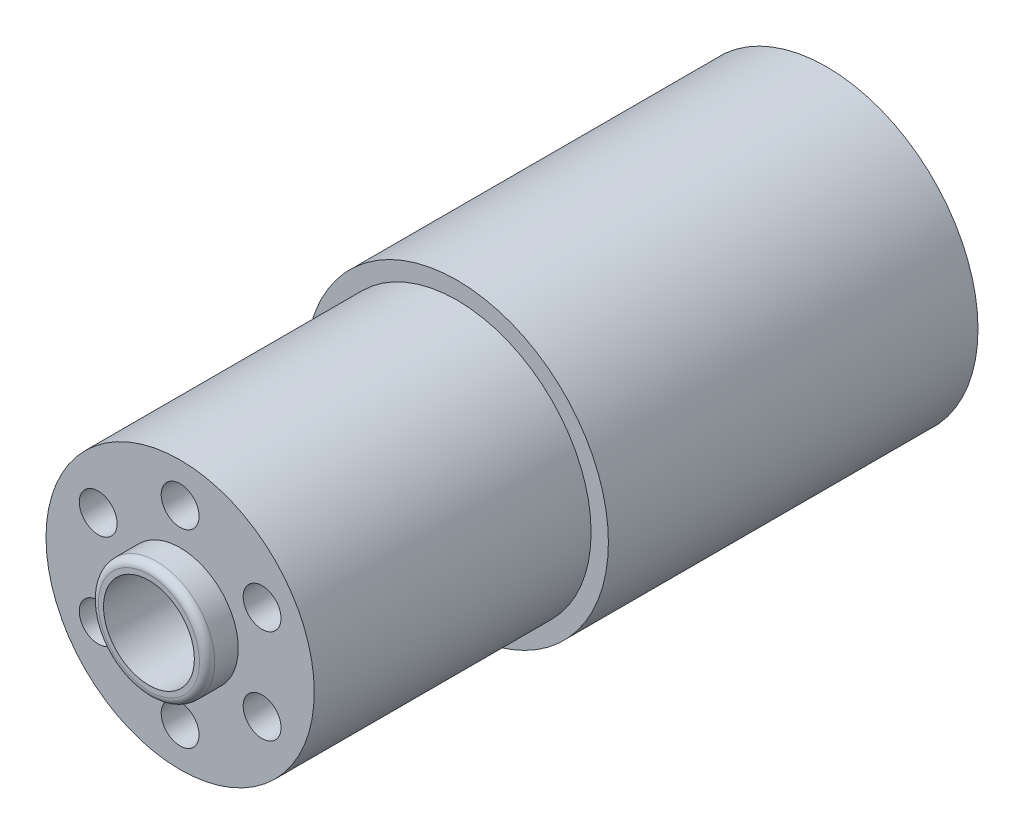
ISO-10303-21;
HEADER;
FILE_DESCRIPTION(('STEP AP214'),'2;1');
FILE_NAME('part.step','',(''),(''),'','','');
FILE_SCHEMA(('AUTOMOTIVE_DESIGN { 1 0 10303 214 1 1 1 1 }'));
ENDSEC;
DATA;
#1=APPLICATION_CONTEXT('core data for automotive mechanical design processes');
#2=APPLICATION_PROTOCOL_DEFINITION('international standard','automotive_design',2000,#1);
#3=PRODUCT_CONTEXT('',#1,'mechanical');
#4=PRODUCT('Part','Part','',(#3));
#5=PRODUCT_RELATED_PRODUCT_CATEGORY('part','',(#4));
#6=PRODUCT_DEFINITION_FORMATION('','',#4);
#7=PRODUCT_DEFINITION_CONTEXT('part definition',#1,'design');
#8=PRODUCT_DEFINITION('design','',#6,#7);
#9=PRODUCT_DEFINITION_SHAPE('','',#8);
#10=(LENGTH_UNIT() NAMED_UNIT(*) SI_UNIT(.MILLI.,.METRE.));
#11=(NAMED_UNIT(*) PLANE_ANGLE_UNIT() SI_UNIT($,.RADIAN.));
#12=(NAMED_UNIT(*) SI_UNIT($,.STERADIAN.) SOLID_ANGLE_UNIT());
#13=UNCERTAINTY_MEASURE_WITH_UNIT(LENGTH_MEASURE(1.E-05),#10,'distance_accuracy_value','');
#14=(GEOMETRIC_REPRESENTATION_CONTEXT(3) GLOBAL_UNCERTAINTY_ASSIGNED_CONTEXT((#13)) GLOBAL_UNIT_ASSIGNED_CONTEXT((#10,
#11,#12)) REPRESENTATION_CONTEXT('',''));
#15=CARTESIAN_POINT('',(0.,0.,0.));
#16=DIRECTION('',(0.,0.,1.));
#17=DIRECTION('',(1.,0.,0.));
#18=AXIS2_PLACEMENT_3D('',#15,#16,#17);
#19=CARTESIAN_POINT('',(0.,0.,0.));
#20=DIRECTION('',(0.,0.,1.));
#21=DIRECTION('',(1.,0.,0.));
#22=AXIS2_PLACEMENT_3D('',#19,#20,#21);
#23=PLANE('',#22);
#24=CARTESIAN_POINT('',(-13.748153285078,7.93749999999999,0.));
#25=DIRECTION('',(0.,0.,1.));
#26=DIRECTION('',(1.,0.,0.));
#27=AXIS2_PLACEMENT_3D('',#24,#25,#26);
#28=CIRCLE('',#27,3.175);
#29=CARTESIAN_POINT('',(-10.573153285078,7.93749999999999,0.));
#30=VERTEX_POINT('',#29);
#31=EDGE_CURVE('E98',#30,#30,#28,.T.);
#32=ORIENTED_EDGE('',*,*,#31,.T.);
#33=EDGE_LOOP('',(#32));
#34=FACE_BOUND('',#33,.T.);
#35=CARTESIAN_POINT('',(-13.748153285078,-7.93750000000001,0.));
#36=DIRECTION('',(0.,0.,1.));
#37=DIRECTION('',(1.,0.,0.));
#38=AXIS2_PLACEMENT_3D('',#35,#36,#37);
#39=CIRCLE('',#38,3.175);
#40=CARTESIAN_POINT('',(-10.573153285078,-7.93750000000001,0.));
#41=VERTEX_POINT('',#40);
#42=EDGE_CURVE('E92',#41,#41,#39,.T.);
#43=ORIENTED_EDGE('',*,*,#42,.T.);
#44=EDGE_LOOP('',(#43));
#45=FACE_BOUND('',#44,.T.);
#46=CARTESIAN_POINT('',(0.,-15.875,0.));
#47=DIRECTION('',(0.,0.,1.));
#48=DIRECTION('',(1.,0.,0.));
#49=AXIS2_PLACEMENT_3D('',#46,#47,#48);
#50=CIRCLE('',#49,3.175);
#51=CARTESIAN_POINT('',(3.175,-15.875,0.));
#52=VERTEX_POINT('',#51);
#53=EDGE_CURVE('E86',#52,#52,#50,.T.);
#54=ORIENTED_EDGE('',*,*,#53,.T.);
#55=EDGE_LOOP('',(#54));
#56=FACE_BOUND('',#55,.T.);
#57=CARTESIAN_POINT('',(13.748153285078,-7.9375,0.));
#58=DIRECTION('',(0.,0.,1.));
#59=DIRECTION('',(1.,0.,0.));
#60=AXIS2_PLACEMENT_3D('',#57,#58,#59);
#61=CIRCLE('',#60,3.175);
#62=CARTESIAN_POINT('',(16.923153285078,-7.9375,0.));
#63=VERTEX_POINT('',#62);
#64=EDGE_CURVE('E80',#63,#63,#61,.T.);
#65=ORIENTED_EDGE('',*,*,#64,.T.);
#66=EDGE_LOOP('',(#65));
#67=FACE_BOUND('',#66,.T.);
#68=CARTESIAN_POINT('',(13.748153285078,7.93750000000001,0.));
#69=DIRECTION('',(0.,0.,1.));
#70=DIRECTION('',(1.,0.,0.));
#71=AXIS2_PLACEMENT_3D('',#68,#69,#70);
#72=CIRCLE('',#71,3.175);
#73=CARTESIAN_POINT('',(16.923153285078,7.93750000000001,0.));
#74=VERTEX_POINT('',#73);
#75=EDGE_CURVE('E74',#74,#74,#72,.T.);
#76=ORIENTED_EDGE('',*,*,#75,.T.);
#77=EDGE_LOOP('',(#76));
#78=FACE_BOUND('',#77,.T.);
#79=CARTESIAN_POINT('',(0.,15.875,0.));
#80=DIRECTION('',(0.,0.,1.));
#81=DIRECTION('',(1.,0.,0.));
#82=AXIS2_PLACEMENT_3D('',#79,#80,#81);
#83=CIRCLE('',#82,3.175);
#84=CARTESIAN_POINT('',(3.175,15.875,0.));
#85=VERTEX_POINT('',#84);
#86=EDGE_CURVE('E68',#85,#85,#83,.T.);
#87=ORIENTED_EDGE('',*,*,#86,.T.);
#88=EDGE_LOOP('',(#87));
#89=FACE_BOUND('',#88,.T.);
#90=CARTESIAN_POINT('',(0.,0.,0.));
#91=DIRECTION('',(0.,0.,1.));
#92=DIRECTION('',(1.,0.,0.));
#93=AXIS2_PLACEMENT_3D('',#90,#91,#92);
#94=CIRCLE('',#93,25.4);
#95=CARTESIAN_POINT('',(25.4,0.,0.));
#96=VERTEX_POINT('',#95);
#97=EDGE_CURVE('E64',#96,#96,#94,.T.);
#98=ORIENTED_EDGE('',*,*,#97,.F.);
#99=EDGE_LOOP('',(#98));
#100=FACE_BOUND('',#99,.T.);
#101=CARTESIAN_POINT('',(0.,0.,0.));
#102=DIRECTION('',(0.,0.,1.));
#103=DIRECTION('',(1.,0.,0.));
#104=AXIS2_PLACEMENT_3D('',#101,#102,#103);
#105=CIRCLE('',#104,9.75);
#106=CARTESIAN_POINT('',(9.75,0.,0.));
#107=VERTEX_POINT('',#106);
#108=EDGE_CURVE('E61',#107,#107,#105,.F.);
#109=ORIENTED_EDGE('',*,*,#108,.F.);
#110=EDGE_LOOP('',(#109));
#111=FACE_BOUND('',#110,.T.);
#112=ADVANCED_FACE('F41',(#34,#45,#56,#67,#78,#89,#100,#111),#23,.F.);
#113=CARTESIAN_POINT('',(0.,0.,108.44022));
#114=DIRECTION('',(0.,0.,1.));
#115=DIRECTION('',(1.,0.,0.));
#116=AXIS2_PLACEMENT_3D('',#113,#114,#115);
#117=PLANE('',#116);
#118=CARTESIAN_POINT('',(0.,0.,108.44022));
#119=DIRECTION('',(0.,0.,-1.));
#120=DIRECTION('',(-1.,0.,0.));
#121=AXIS2_PLACEMENT_3D('',#118,#119,#120);
#122=CIRCLE('',#121,22.5);
#123=CARTESIAN_POINT('',(-22.5,0.,108.44022));
#124=VERTEX_POINT('',#123);
#125=EDGE_CURVE('E112',#124,#124,#122,.T.);
#126=ORIENTED_EDGE('',*,*,#125,.F.);
#127=EDGE_LOOP('',(#126));
#128=FACE_BOUND('',#127,.T.);
#129=CARTESIAN_POINT('',(-13.748153285078,7.93749999999999,108.44022));
#130=DIRECTION('',(0.,0.,1.));
#131=DIRECTION('',(1.,0.,0.));
#132=AXIS2_PLACEMENT_3D('',#129,#130,#131);
#133=CIRCLE('',#132,3.175);
#134=CARTESIAN_POINT('',(-10.573153285078,7.93749999999999,108.44022));
#135=VERTEX_POINT('',#134);
#136=EDGE_CURVE('E95',#135,#135,#133,.T.);
#137=ORIENTED_EDGE('',*,*,#136,.F.);
#138=EDGE_LOOP('',(#137));
#139=FACE_BOUND('',#138,.T.);
#140=CARTESIAN_POINT('',(0.,-15.875,108.44022));
#141=DIRECTION('',(0.,0.,1.));
#142=DIRECTION('',(1.,0.,0.));
#143=AXIS2_PLACEMENT_3D('',#140,#141,#142);
#144=CIRCLE('',#143,3.175);
#145=CARTESIAN_POINT('',(3.175,-15.875,108.44022));
#146=VERTEX_POINT('',#145);
#147=EDGE_CURVE('E83',#146,#146,#144,.T.);
#148=ORIENTED_EDGE('',*,*,#147,.F.);
#149=EDGE_LOOP('',(#148));
#150=FACE_BOUND('',#149,.T.);
#151=CARTESIAN_POINT('',(13.748153285078,7.93750000000001,108.44022));
#152=DIRECTION('',(0.,0.,1.));
#153=DIRECTION('',(1.,0.,0.));
#154=AXIS2_PLACEMENT_3D('',#151,#152,#153);
#155=CIRCLE('',#154,3.175);
#156=CARTESIAN_POINT('',(16.923153285078,7.93750000000001,108.44022));
#157=VERTEX_POINT('',#156);
#158=EDGE_CURVE('E71',#157,#157,#155,.T.);
#159=ORIENTED_EDGE('',*,*,#158,.F.);
#160=EDGE_LOOP('',(#159));
#161=FACE_BOUND('',#160,.T.);
#162=CARTESIAN_POINT('',(0.,15.875,108.44022));
#163=DIRECTION('',(0.,0.,1.));
#164=DIRECTION('',(1.,0.,0.));
#165=AXIS2_PLACEMENT_3D('',#162,#163,#164);
#166=CIRCLE('',#165,3.175);
#167=CARTESIAN_POINT('',(3.175,15.875,108.44022));
#168=VERTEX_POINT('',#167);
#169=EDGE_CURVE('E67',#168,#168,#166,.T.);
#170=ORIENTED_EDGE('',*,*,#169,.F.);
#171=EDGE_LOOP('',(#170));
#172=FACE_BOUND('',#171,.T.);
#173=CARTESIAN_POINT('',(13.748153285078,-7.9375,108.44022));
#174=DIRECTION('',(0.,0.,1.));
#175=DIRECTION('',(1.,0.,0.));
#176=AXIS2_PLACEMENT_3D('',#173,#174,#175);
#177=CIRCLE('',#176,3.175);
#178=CARTESIAN_POINT('',(16.923153285078,-7.9375,108.44022));
#179=VERTEX_POINT('',#178);
#180=EDGE_CURVE('E77',#179,#179,#177,.T.);
#181=ORIENTED_EDGE('',*,*,#180,.F.);
#182=EDGE_LOOP('',(#181));
#183=FACE_BOUND('',#182,.T.);
#184=CARTESIAN_POINT('',(-13.748153285078,-7.93750000000001,108.44022));
#185=DIRECTION('',(0.,0.,1.));
#186=DIRECTION('',(1.,0.,0.));
#187=AXIS2_PLACEMENT_3D('',#184,#185,#186);
#188=CIRCLE('',#187,3.175);
#189=CARTESIAN_POINT('',(-10.573153285078,-7.93750000000001,108.44022));
#190=VERTEX_POINT('',#189);
#191=EDGE_CURVE('E89',#190,#190,#188,.T.);
#192=ORIENTED_EDGE('',*,*,#191,.F.);
#193=EDGE_LOOP('',(#192));
#194=FACE_BOUND('',#193,.T.);
#195=CARTESIAN_POINT('',(0.,0.,108.44022));
#196=DIRECTION('',(0.,0.,1.));
#197=DIRECTION('',(1.,0.,0.));
#198=AXIS2_PLACEMENT_3D('',#195,#196,#197);
#199=CIRCLE('',#198,9.75);
#200=CARTESIAN_POINT('',(9.75,0.,108.44022));
#201=VERTEX_POINT('',#200);
#202=EDGE_CURVE('E101',#201,#201,#199,.T.);
#203=ORIENTED_EDGE('',*,*,#202,.F.);
#204=EDGE_LOOP('',(#203));
#205=FACE_BOUND('',#204,.T.);
#206=ADVANCED_FACE('F137',(#128,#139,#150,#161,#172,#183,#194,#205),#117,.T.);
#207=CARTESIAN_POINT('',(0.,0.,108.44022));
#208=DIRECTION('',(0.,0.,-1.));
#209=DIRECTION('',(-1.,0.,0.));
#210=AXIS2_PLACEMENT_3D('',#207,#208,#209);
#211=CYLINDRICAL_SURFACE('',#210,25.4);
#212=CARTESIAN_POINT('',(0.,0.,62.00002));
#213=DIRECTION('',(0.,0.,-1.));
#214=DIRECTION('',(-1.,0.,0.));
#215=AXIS2_PLACEMENT_3D('',#212,#213,#214);
#216=CIRCLE('',#215,25.4);
#217=CARTESIAN_POINT('',(-25.4,0.,62.00002));
#218=VERTEX_POINT('',#217);
#219=EDGE_CURVE('E118',#218,#218,#216,.T.);
#220=ORIENTED_EDGE('',*,*,#219,.T.);
#221=EDGE_LOOP('',(#220));
#222=FACE_BOUND('',#221,.T.);
#223=ORIENTED_EDGE('',*,*,#97,.T.);
#224=EDGE_LOOP('',(#223));
#225=FACE_BOUND('',#224,.T.);
#226=ADVANCED_FACE('F122',(#222,#225),#211,.T.);
#227=CARTESIAN_POINT('',(0.,0.,108.44022));
#228=DIRECTION('',(0.,0.,-1.));
#229=DIRECTION('',(-1.,0.,0.));
#230=AXIS2_PLACEMENT_3D('',#227,#228,#229);
#231=CYLINDRICAL_SURFACE('',#230,7.62);
#232=CARTESIAN_POINT('',(0.,0.,113.67262));
#233=DIRECTION('',(0.,0.,1.));
#234=DIRECTION('',(1.,0.,0.));
#235=AXIS2_PLACEMENT_3D('',#232,#233,#234);
#236=CIRCLE('',#235,7.62);
#237=CARTESIAN_POINT('',(7.62,0.,113.67262));
#238=VERTEX_POINT('',#237);
#239=EDGE_CURVE('E106',#238,#238,#236,.T.);
#240=ORIENTED_EDGE('',*,*,#239,.T.);
#241=EDGE_LOOP('',(#240));
#242=FACE_BOUND('',#241,.T.);
#243=CARTESIAN_POINT('',(0.,0.,-4.4577));
#244=DIRECTION('',(0.,0.,-1.));
#245=DIRECTION('',(-1.,0.,0.));
#246=AXIS2_PLACEMENT_3D('',#243,#244,#245);
#247=CIRCLE('',#246,7.62);
#248=CARTESIAN_POINT('',(-7.62,0.,-4.4577));
#249=VERTEX_POINT('',#248);
#250=EDGE_CURVE('E109',#249,#249,#247,.T.);
#251=ORIENTED_EDGE('',*,*,#250,.T.);
#252=EDGE_LOOP('',(#251));
#253=FACE_BOUND('',#252,.T.);
#254=ADVANCED_FACE('F179',(#242,#253),#231,.F.);
#255=CARTESIAN_POINT('',(0.,15.875,108.44022));
#256=DIRECTION('',(0.,0.,-1.));
#257=DIRECTION('',(-1.,0.,0.));
#258=AXIS2_PLACEMENT_3D('',#255,#256,#257);
#259=CYLINDRICAL_SURFACE('',#258,3.175);
#260=ORIENTED_EDGE('',*,*,#169,.T.);
#261=EDGE_LOOP('',(#260));
#262=FACE_BOUND('',#261,.T.);
#263=ORIENTED_EDGE('',*,*,#86,.F.);
#264=EDGE_LOOP('',(#263));
#265=FACE_BOUND('',#264,.T.);
#266=ADVANCED_FACE('F197',(#262,#265),#259,.F.);
#267=CARTESIAN_POINT('',(13.748153285078,7.93750000000001,108.44022));
#268=DIRECTION('',(0.,0.,-1.));
#269=DIRECTION('',(-1.,0.,0.));
#270=AXIS2_PLACEMENT_3D('',#267,#268,#269);
#271=CYLINDRICAL_SURFACE('',#270,3.175);
#272=ORIENTED_EDGE('',*,*,#158,.T.);
#273=EDGE_LOOP('',(#272));
#274=FACE_BOUND('',#273,.T.);
#275=ORIENTED_EDGE('',*,*,#75,.F.);
#276=EDGE_LOOP('',(#275));
#277=FACE_BOUND('',#276,.T.);
#278=ADVANCED_FACE('F202',(#274,#277),#271,.F.);
#279=CARTESIAN_POINT('',(13.748153285078,-7.9375,108.44022));
#280=DIRECTION('',(0.,0.,-1.));
#281=DIRECTION('',(-1.,0.,0.));
#282=AXIS2_PLACEMENT_3D('',#279,#280,#281);
#283=CYLINDRICAL_SURFACE('',#282,3.175);
#284=ORIENTED_EDGE('',*,*,#180,.T.);
#285=EDGE_LOOP('',(#284));
#286=FACE_BOUND('',#285,.T.);
#287=ORIENTED_EDGE('',*,*,#64,.F.);
#288=EDGE_LOOP('',(#287));
#289=FACE_BOUND('',#288,.T.);
#290=ADVANCED_FACE('F208',(#286,#289),#283,.F.);
#291=CARTESIAN_POINT('',(0.,-15.875,108.44022));
#292=DIRECTION('',(0.,0.,-1.));
#293=DIRECTION('',(-1.,0.,0.));
#294=AXIS2_PLACEMENT_3D('',#291,#292,#293);
#295=CYLINDRICAL_SURFACE('',#294,3.175);
#296=ORIENTED_EDGE('',*,*,#147,.T.);
#297=EDGE_LOOP('',(#296));
#298=FACE_BOUND('',#297,.T.);
#299=ORIENTED_EDGE('',*,*,#53,.F.);
#300=EDGE_LOOP('',(#299));
#301=FACE_BOUND('',#300,.T.);
#302=ADVANCED_FACE('F212',(#298,#301),#295,.F.);
#303=CARTESIAN_POINT('',(-13.748153285078,-7.93750000000001,108.44022));
#304=DIRECTION('',(0.,0.,-1.));
#305=DIRECTION('',(-1.,0.,0.));
#306=AXIS2_PLACEMENT_3D('',#303,#304,#305);
#307=CYLINDRICAL_SURFACE('',#306,3.175);
#308=ORIENTED_EDGE('',*,*,#191,.T.);
#309=EDGE_LOOP('',(#308));
#310=FACE_BOUND('',#309,.T.);
#311=ORIENTED_EDGE('',*,*,#42,.F.);
#312=EDGE_LOOP('',(#311));
#313=FACE_BOUND('',#312,.T.);
#314=ADVANCED_FACE('F216',(#310,#313),#307,.F.);
#315=CARTESIAN_POINT('',(-13.748153285078,7.93749999999999,108.44022));
#316=DIRECTION('',(0.,0.,-1.));
#317=DIRECTION('',(-1.,0.,0.));
#318=AXIS2_PLACEMENT_3D('',#315,#316,#317);
#319=CYLINDRICAL_SURFACE('',#318,3.175);
#320=ORIENTED_EDGE('',*,*,#136,.T.);
#321=EDGE_LOOP('',(#320));
#322=FACE_BOUND('',#321,.T.);
#323=ORIENTED_EDGE('',*,*,#31,.F.);
#324=EDGE_LOOP('',(#323));
#325=FACE_BOUND('',#324,.T.);
#326=ADVANCED_FACE('F167',(#322,#325),#319,.F.);
#327=CARTESIAN_POINT('',(0.,0.,113.67262));
#328=DIRECTION('',(0.,0.,1.));
#329=DIRECTION('',(1.,0.,0.));
#330=AXIS2_PLACEMENT_3D('',#327,#328,#329);
#331=PLANE('',#330);
#332=CARTESIAN_POINT('',(0.,0.,113.67262));
#333=DIRECTION('',(0.,0.,1.));
#334=DIRECTION('',(1.,0.,0.));
#335=AXIS2_PLACEMENT_3D('',#332,#333,#334);
#336=CIRCLE('',#335,8.48);
#337=CARTESIAN_POINT('',(8.48,0.,113.67262));
#338=VERTEX_POINT('',#337);
#339=EDGE_CURVE('E48',#338,#338,#336,.T.);
#340=ORIENTED_EDGE('',*,*,#339,.T.);
#341=EDGE_LOOP('',(#340));
#342=FACE_BOUND('',#341,.T.);
#343=ORIENTED_EDGE('',*,*,#239,.F.);
#344=EDGE_LOOP('',(#343));
#345=FACE_BOUND('',#344,.T.);
#346=ADVANCED_FACE('F158',(#342,#345),#331,.T.);
#347=CARTESIAN_POINT('',(0.,0.,113.67262));
#348=DIRECTION('',(0.,0.,-1.));
#349=DIRECTION('',(-1.,0.,0.));
#350=AXIS2_PLACEMENT_3D('',#347,#348,#349);
#351=CYLINDRICAL_SURFACE('',#350,9.75);
#352=CARTESIAN_POINT('',(0.,0.,112.40262));
#353=DIRECTION('',(0.,0.,1.));
#354=DIRECTION('',(1.,0.,0.));
#355=AXIS2_PLACEMENT_3D('',#352,#353,#354);
#356=CIRCLE('',#355,9.75);
#357=CARTESIAN_POINT('',(9.75,0.,112.40262));
#358=VERTEX_POINT('',#357);
#359=EDGE_CURVE('E10',#358,#358,#356,.F.);
#360=ORIENTED_EDGE('',*,*,#359,.T.);
#361=EDGE_LOOP('',(#360));
#362=FACE_BOUND('',#361,.T.);
#363=ORIENTED_EDGE('',*,*,#202,.T.);
#364=EDGE_LOOP('',(#363));
#365=FACE_BOUND('',#364,.T.);
#366=ADVANCED_FACE('F155',(#362,#365),#351,.T.);
#367=CARTESIAN_POINT('',(0.,0.,-4.4577));
#368=DIRECTION('',(0.,0.,-1.));
#369=DIRECTION('',(-1.,0.,0.));
#370=AXIS2_PLACEMENT_3D('',#367,#368,#369);
#371=PLANE('',#370);
#372=CARTESIAN_POINT('',(0.,0.,-4.4577));
#373=DIRECTION('',(0.,0.,-1.));
#374=DIRECTION('',(-1.,0.,0.));
#375=AXIS2_PLACEMENT_3D('',#372,#373,#374);
#376=CIRCLE('',#375,8.48);
#377=CARTESIAN_POINT('',(-8.48,0.,-4.4577));
#378=VERTEX_POINT('',#377);
#379=EDGE_CURVE('E56',#378,#378,#376,.T.);
#380=ORIENTED_EDGE('',*,*,#379,.T.);
#381=EDGE_LOOP('',(#380));
#382=FACE_BOUND('',#381,.T.);
#383=ORIENTED_EDGE('',*,*,#250,.F.);
#384=EDGE_LOOP('',(#383));
#385=FACE_BOUND('',#384,.T.);
#386=ADVANCED_FACE('F157',(#382,#385),#371,.T.);
#387=CARTESIAN_POINT('',(0.,0.,-4.4577));
#388=DIRECTION('',(0.,0.,1.));
#389=DIRECTION('',(1.,0.,0.));
#390=AXIS2_PLACEMENT_3D('',#387,#388,#389);
#391=CYLINDRICAL_SURFACE('',#390,9.75);
#392=CARTESIAN_POINT('',(0.,0.,-3.1877));
#393=DIRECTION('',(0.,0.,-1.));
#394=DIRECTION('',(-1.,0.,0.));
#395=AXIS2_PLACEMENT_3D('',#392,#393,#394);
#396=CIRCLE('',#395,9.75);
#397=CARTESIAN_POINT('',(-9.75,0.,-3.1877));
#398=VERTEX_POINT('',#397);
#399=EDGE_CURVE('E52',#398,#398,#396,.F.);
#400=ORIENTED_EDGE('',*,*,#399,.T.);
#401=EDGE_LOOP('',(#400));
#402=FACE_BOUND('',#401,.T.);
#403=ORIENTED_EDGE('',*,*,#108,.T.);
#404=EDGE_LOOP('',(#403));
#405=FACE_BOUND('',#404,.T.);
#406=ADVANCED_FACE('F164',(#402,#405),#391,.T.);
#407=CARTESIAN_POINT('',(0.,0.,-3.1877));
#408=DIRECTION('',(0.,0.,-1.));
#409=DIRECTION('',(-1.,0.,0.));
#410=AXIS2_PLACEMENT_3D('',#407,#408,#409);
#411=TOROIDAL_SURFACE('',#410,8.48,1.27);
#412=ORIENTED_EDGE('',*,*,#399,.F.);
#413=EDGE_LOOP('',(#412));
#414=FACE_BOUND('',#413,.T.);
#415=ORIENTED_EDGE('',*,*,#379,.F.);
#416=EDGE_LOOP('',(#415));
#417=FACE_BOUND('',#416,.T.);
#418=ADVANCED_FACE('F180',(#414,#417),#411,.T.);
#419=CARTESIAN_POINT('',(0.,0.,112.40262));
#420=DIRECTION('',(0.,0.,1.));
#421=DIRECTION('',(1.,0.,0.));
#422=AXIS2_PLACEMENT_3D('',#419,#420,#421);
#423=TOROIDAL_SURFACE('',#422,8.48,1.27);
#424=ORIENTED_EDGE('',*,*,#359,.F.);
#425=EDGE_LOOP('',(#424));
#426=FACE_BOUND('',#425,.T.);
#427=ORIENTED_EDGE('',*,*,#339,.F.);
#428=EDGE_LOOP('',(#427));
#429=FACE_BOUND('',#428,.T.);
#430=ADVANCED_FACE('F43',(#426,#429),#423,.T.);
#431=CARTESIAN_POINT('',(0.,0.,0.));
#432=DIRECTION('',(0.,0.,-1.));
#433=DIRECTION('',(-1.,0.,0.));
#434=AXIS2_PLACEMENT_3D('',#431,#432,#433);
#435=CYLINDRICAL_SURFACE('',#434,22.5);
#436=CARTESIAN_POINT('',(0.,0.,62.00002));
#437=DIRECTION('',(0.,0.,-1.));
#438=DIRECTION('',(-1.,0.,0.));
#439=AXIS2_PLACEMENT_3D('',#436,#437,#438);
#440=CIRCLE('',#439,22.5);
#441=CARTESIAN_POINT('',(-22.5,0.,62.00002));
#442=VERTEX_POINT('',#441);
#443=EDGE_CURVE('E115',#442,#442,#440,.T.);
#444=ORIENTED_EDGE('',*,*,#443,.F.);
#445=EDGE_LOOP('',(#444));
#446=FACE_BOUND('',#445,.T.);
#447=ORIENTED_EDGE('',*,*,#125,.T.);
#448=EDGE_LOOP('',(#447));
#449=FACE_BOUND('',#448,.T.);
#450=ADVANCED_FACE('F128',(#446,#449),#435,.T.);
#451=CARTESIAN_POINT('',(0.,25.4,62.00002));
#452=DIRECTION('',(0.,0.,-1.));
#453=DIRECTION('',(-1.,0.,0.));
#454=AXIS2_PLACEMENT_3D('',#451,#452,#453);
#455=PLANE('',#454);
#456=ORIENTED_EDGE('',*,*,#219,.F.);
#457=EDGE_LOOP('',(#456));
#458=FACE_BOUND('',#457,.T.);
#459=ORIENTED_EDGE('',*,*,#443,.T.);
#460=EDGE_LOOP('',(#459));
#461=FACE_BOUND('',#460,.T.);
#462=ADVANCED_FACE('F125',(#458,#461),#455,.F.);
#463=CLOSED_SHELL('',(#112,#206,#226,#254,#266,#278,#290,#302,#314,#326,#346,#366,#386,#406,
#418,#430,#450,#462));
#464=MANIFOLD_SOLID_BREP('B2',#463);
#465=ADVANCED_BREP_SHAPE_REPRESENTATION('',(#18,#464),#14);
#466=SHAPE_DEFINITION_REPRESENTATION(#9,#465);
ENDSEC;
END-ISO-10303-21;
